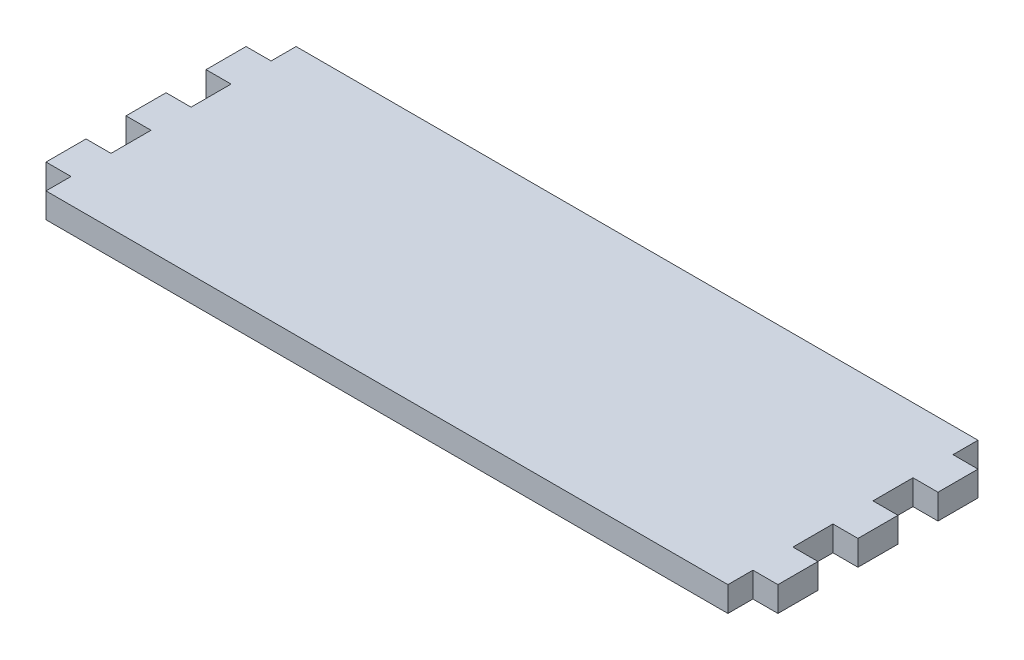
ISO-10303-21;
HEADER;
FILE_DESCRIPTION(('STEP AP214'),'2;1');
FILE_NAME('part.step','',(''),(''),'','','');
FILE_SCHEMA(('AUTOMOTIVE_DESIGN { 1 0 10303 214 1 1 1 1 }'));
ENDSEC;
DATA;
#1=APPLICATION_CONTEXT('core data for automotive mechanical design processes');
#2=APPLICATION_PROTOCOL_DEFINITION('international standard','automotive_design',2000,#1);
#3=PRODUCT_CONTEXT('',#1,'mechanical');
#4=PRODUCT('Part','Part','',(#3));
#5=PRODUCT_RELATED_PRODUCT_CATEGORY('part','',(#4));
#6=PRODUCT_DEFINITION_FORMATION('','',#4);
#7=PRODUCT_DEFINITION_CONTEXT('part definition',#1,'design');
#8=PRODUCT_DEFINITION('design','',#6,#7);
#9=PRODUCT_DEFINITION_SHAPE('','',#8);
#10=(LENGTH_UNIT() NAMED_UNIT(*) SI_UNIT(.MILLI.,.METRE.));
#11=(NAMED_UNIT(*) PLANE_ANGLE_UNIT() SI_UNIT($,.RADIAN.));
#12=(NAMED_UNIT(*) SI_UNIT($,.STERADIAN.) SOLID_ANGLE_UNIT());
#13=UNCERTAINTY_MEASURE_WITH_UNIT(LENGTH_MEASURE(1.E-05),#10,'distance_accuracy_value','');
#14=(GEOMETRIC_REPRESENTATION_CONTEXT(3) GLOBAL_UNCERTAINTY_ASSIGNED_CONTEXT((#13)) GLOBAL_UNIT_ASSIGNED_CONTEXT((#10,
#11,#12)) REPRESENTATION_CONTEXT('',''));
#15=CARTESIAN_POINT('',(0.,0.,0.));
#16=DIRECTION('',(0.,0.,1.));
#17=DIRECTION('',(1.,0.,0.));
#18=AXIS2_PLACEMENT_3D('',#15,#16,#17);
#19=CARTESIAN_POINT('',(-65.51933623944,3.,-2.9418119022154));
#20=DIRECTION('',(1.,0.,0.));
#21=DIRECTION('',(0.,0.,-1.));
#22=AXIS2_PLACEMENT_3D('',#19,#20,#21);
#23=PLANE('',#22);
#24=DIRECTION('',(0.,0.,1.));
#25=VECTOR('',#24,1.);
#26=CARTESIAN_POINT('',(-65.51933623944,0.,-2.9418119022154));
#27=LINE('',#26,#25);
#28=CARTESIAN_POINT('',(-65.51933623944,0.,-7.74181190221546));
#29=VERTEX_POINT('',#28);
#30=CARTESIAN_POINT('',(-65.51933623944,0.,-2.9418119022154));
#31=VERTEX_POINT('',#30);
#32=EDGE_CURVE('E260',#29,#31,#27,.T.);
#33=ORIENTED_EDGE('',*,*,#32,.T.);
#34=DIRECTION('',(0.,-1.,0.));
#35=VECTOR('',#34,1.);
#36=CARTESIAN_POINT('',(-65.51933623944,3.,-2.9418119022154));
#37=LINE('',#36,#35);
#38=CARTESIAN_POINT('',(-65.51933623944,3.,-2.9418119022154));
#39=VERTEX_POINT('',#38);
#40=EDGE_CURVE('E11',#39,#31,#37,.T.);
#41=ORIENTED_EDGE('',*,*,#40,.F.);
#42=DIRECTION('',(0.,0.,1.));
#43=VECTOR('',#42,1.);
#44=CARTESIAN_POINT('',(-65.51933623944,3.,-2.9418119022154));
#45=LINE('',#44,#43);
#46=CARTESIAN_POINT('',(-65.51933623944,3.,-7.74181190221546));
#47=VERTEX_POINT('',#46);
#48=EDGE_CURVE('E342',#47,#39,#45,.T.);
#49=ORIENTED_EDGE('',*,*,#48,.F.);
#50=DIRECTION('',(0.,-1.,0.));
#51=VECTOR('',#50,1.);
#52=CARTESIAN_POINT('',(-65.51933623944,3.,-7.74181190221546));
#53=LINE('',#52,#51);
#54=EDGE_CURVE('E256',#47,#29,#53,.T.);
#55=ORIENTED_EDGE('',*,*,#54,.T.);
#56=EDGE_LOOP('',(#33,#41,#49,#55));
#57=FACE_BOUND('',#56,.T.);
#58=ADVANCED_FACE('F39',(#57),#23,.F.);
#59=CARTESIAN_POINT('',(-62.51933623944,3.,-2.9418119022154));
#60=DIRECTION('',(0.,0.,-1.));
#61=DIRECTION('',(-1.,0.,0.));
#62=AXIS2_PLACEMENT_3D('',#59,#60,#61);
#63=PLANE('',#62);
#64=DIRECTION('',(1.,0.,0.));
#65=VECTOR('',#64,1.);
#66=CARTESIAN_POINT('',(-62.51933623944,0.,-2.9418119022154));
#67=LINE('',#66,#65);
#68=CARTESIAN_POINT('',(-62.51933623944,0.,-2.9418119022154));
#69=VERTEX_POINT('',#68);
#70=EDGE_CURVE('E264',#31,#69,#67,.T.);
#71=ORIENTED_EDGE('',*,*,#70,.T.);
#72=DIRECTION('',(0.,-1.,0.));
#73=VECTOR('',#72,1.);
#74=CARTESIAN_POINT('',(-62.51933623944,3.,-2.9418119022154));
#75=LINE('',#74,#73);
#76=CARTESIAN_POINT('',(-62.51933623944,3.,-2.9418119022154));
#77=VERTEX_POINT('',#76);
#78=EDGE_CURVE('E48',#77,#69,#75,.T.);
#79=ORIENTED_EDGE('',*,*,#78,.F.);
#80=DIRECTION('',(1.,0.,0.));
#81=VECTOR('',#80,1.);
#82=CARTESIAN_POINT('',(-62.51933623944,3.,-2.9418119022154));
#83=LINE('',#82,#81);
#84=EDGE_CURVE('E159',#39,#77,#83,.T.);
#85=ORIENTED_EDGE('',*,*,#84,.F.);
#86=ORIENTED_EDGE('',*,*,#40,.T.);
#87=EDGE_LOOP('',(#71,#79,#85,#86));
#88=FACE_BOUND('',#87,.T.);
#89=ADVANCED_FACE('F548',(#88),#63,.F.);
#90=CARTESIAN_POINT('',(-62.5193362394399,3.,1.8581880977846));
#91=DIRECTION('',(1.,0.,0.));
#92=DIRECTION('',(0.,0.,-1.));
#93=AXIS2_PLACEMENT_3D('',#90,#91,#92);
#94=PLANE('',#93);
#95=DIRECTION('',(0.,0.,1.));
#96=VECTOR('',#95,1.);
#97=CARTESIAN_POINT('',(-62.5193362394399,0.,1.8581880977846));
#98=LINE('',#97,#96);
#99=CARTESIAN_POINT('',(-62.5193362394399,0.,1.8581880977846));
#100=VERTEX_POINT('',#99);
#101=EDGE_CURVE('E267',#69,#100,#98,.T.);
#102=ORIENTED_EDGE('',*,*,#101,.T.);
#103=DIRECTION('',(0.,-1.,0.));
#104=VECTOR('',#103,1.);
#105=CARTESIAN_POINT('',(-62.5193362394399,3.,1.8581880977846));
#106=LINE('',#105,#104);
#107=CARTESIAN_POINT('',(-62.5193362394399,3.,1.8581880977846));
#108=VERTEX_POINT('',#107);
#109=EDGE_CURVE('E433',#108,#100,#106,.T.);
#110=ORIENTED_EDGE('',*,*,#109,.F.);
#111=DIRECTION('',(0.,0.,1.));
#112=VECTOR('',#111,1.);
#113=CARTESIAN_POINT('',(-62.5193362394399,3.,1.8581880977846));
#114=LINE('',#113,#112);
#115=EDGE_CURVE('E443',#77,#108,#114,.T.);
#116=ORIENTED_EDGE('',*,*,#115,.F.);
#117=ORIENTED_EDGE('',*,*,#78,.T.);
#118=EDGE_LOOP('',(#102,#110,#116,#117));
#119=FACE_BOUND('',#118,.T.);
#120=ADVANCED_FACE('F441',(#119),#94,.F.);
#121=CARTESIAN_POINT('',(-65.5193362394399,3.,1.8581880977846));
#122=DIRECTION('',(0.,0.,1.));
#123=DIRECTION('',(1.,0.,0.));
#124=AXIS2_PLACEMENT_3D('',#121,#122,#123);
#125=PLANE('',#124);
#126=DIRECTION('',(-1.,0.,0.));
#127=VECTOR('',#126,1.);
#128=CARTESIAN_POINT('',(-65.5193362394399,0.,1.8581880977846));
#129=LINE('',#128,#127);
#130=CARTESIAN_POINT('',(-65.5193362394399,0.,1.8581880977846));
#131=VERTEX_POINT('',#130);
#132=EDGE_CURVE('E270',#100,#131,#129,.T.);
#133=ORIENTED_EDGE('',*,*,#132,.T.);
#134=DIRECTION('',(0.,-1.,0.));
#135=VECTOR('',#134,1.);
#136=CARTESIAN_POINT('',(-65.5193362394399,3.,1.8581880977846));
#137=LINE('',#136,#135);
#138=CARTESIAN_POINT('',(-65.5193362394399,3.,1.8581880977846));
#139=VERTEX_POINT('',#138);
#140=EDGE_CURVE('E429',#139,#131,#137,.T.);
#141=ORIENTED_EDGE('',*,*,#140,.F.);
#142=DIRECTION('',(-1.,0.,0.));
#143=VECTOR('',#142,1.);
#144=CARTESIAN_POINT('',(-65.5193362394399,3.,1.8581880977846));
#145=LINE('',#144,#143);
#146=EDGE_CURVE('E462',#108,#139,#145,.T.);
#147=ORIENTED_EDGE('',*,*,#146,.F.);
#148=ORIENTED_EDGE('',*,*,#109,.T.);
#149=EDGE_LOOP('',(#133,#141,#147,#148));
#150=FACE_BOUND('',#149,.T.);
#151=ADVANCED_FACE('F452',(#150),#125,.F.);
#152=CARTESIAN_POINT('',(-65.5193362394399,3.,1.8581880977846));
#153=DIRECTION('',(1.,0.,0.));
#154=DIRECTION('',(0.,0.,-1.));
#155=AXIS2_PLACEMENT_3D('',#152,#153,#154);
#156=PLANE('',#155);
#157=DIRECTION('',(0.,0.,1.));
#158=VECTOR('',#157,1.);
#159=CARTESIAN_POINT('',(-65.5193362394399,0.,1.8581880977846));
#160=LINE('',#159,#158);
#161=CARTESIAN_POINT('',(-65.5193362394399,0.,6.6581880977846));
#162=VERTEX_POINT('',#161);
#163=EDGE_CURVE('E273',#131,#162,#160,.T.);
#164=ORIENTED_EDGE('',*,*,#163,.T.);
#165=DIRECTION('',(0.,-1.,0.));
#166=VECTOR('',#165,1.);
#167=CARTESIAN_POINT('',(-65.5193362394399,3.,6.6581880977846));
#168=LINE('',#167,#166);
#169=CARTESIAN_POINT('',(-65.5193362394399,3.,6.6581880977846));
#170=VERTEX_POINT('',#169);
#171=EDGE_CURVE('E425',#170,#162,#168,.T.);
#172=ORIENTED_EDGE('',*,*,#171,.F.);
#173=DIRECTION('',(0.,0.,1.));
#174=VECTOR('',#173,1.);
#175=CARTESIAN_POINT('',(-65.5193362394399,3.,1.8581880977846));
#176=LINE('',#175,#174);
#177=EDGE_CURVE('E458',#139,#170,#176,.T.);
#178=ORIENTED_EDGE('',*,*,#177,.F.);
#179=ORIENTED_EDGE('',*,*,#140,.T.);
#180=EDGE_LOOP('',(#164,#172,#178,#179));
#181=FACE_BOUND('',#180,.T.);
#182=ADVANCED_FACE('F456',(#181),#156,.F.);
#183=CARTESIAN_POINT('',(-65.5193362394399,3.,6.6581880977846));
#184=DIRECTION('',(0.,0.,-1.));
#185=DIRECTION('',(-1.,0.,0.));
#186=AXIS2_PLACEMENT_3D('',#183,#184,#185);
#187=PLANE('',#186);
#188=DIRECTION('',(1.,0.,0.));
#189=VECTOR('',#188,1.);
#190=CARTESIAN_POINT('',(-65.5193362394399,0.,6.6581880977846));
#191=LINE('',#190,#189);
#192=CARTESIAN_POINT('',(-62.5193362394399,0.,6.6581880977846));
#193=VERTEX_POINT('',#192);
#194=EDGE_CURVE('E276',#162,#193,#191,.T.);
#195=ORIENTED_EDGE('',*,*,#194,.T.);
#196=DIRECTION('',(0.,-1.,0.));
#197=VECTOR('',#196,1.);
#198=CARTESIAN_POINT('',(-62.5193362394399,3.,6.6581880977846));
#199=LINE('',#198,#197);
#200=CARTESIAN_POINT('',(-62.5193362394399,3.,6.6581880977846));
#201=VERTEX_POINT('',#200);
#202=EDGE_CURVE('E421',#201,#193,#199,.T.);
#203=ORIENTED_EDGE('',*,*,#202,.F.);
#204=DIRECTION('',(1.,0.,0.));
#205=VECTOR('',#204,1.);
#206=CARTESIAN_POINT('',(-65.5193362394399,3.,6.6581880977846));
#207=LINE('',#206,#205);
#208=EDGE_CURVE('E461',#170,#201,#207,.T.);
#209=ORIENTED_EDGE('',*,*,#208,.F.);
#210=ORIENTED_EDGE('',*,*,#171,.T.);
#211=EDGE_LOOP('',(#195,#203,#209,#210));
#212=FACE_BOUND('',#211,.T.);
#213=ADVANCED_FACE('F561',(#212),#187,.F.);
#214=CARTESIAN_POINT('',(-62.5193362394399,3.,6.6581880977846));
#215=DIRECTION('',(1.,0.,0.));
#216=DIRECTION('',(0.,0.,-1.));
#217=AXIS2_PLACEMENT_3D('',#214,#215,#216);
#218=PLANE('',#217);
#219=DIRECTION('',(0.,0.,1.));
#220=VECTOR('',#219,1.);
#221=CARTESIAN_POINT('',(-62.5193362394399,0.,6.6581880977846));
#222=LINE('',#221,#220);
#223=CARTESIAN_POINT('',(-62.5193362394399,0.,11.4581880977846));
#224=VERTEX_POINT('',#223);
#225=EDGE_CURVE('E279',#193,#224,#222,.T.);
#226=ORIENTED_EDGE('',*,*,#225,.T.);
#227=DIRECTION('',(0.,-1.,0.));
#228=VECTOR('',#227,1.);
#229=CARTESIAN_POINT('',(-62.5193362394399,3.,11.4581880977846));
#230=LINE('',#229,#228);
#231=CARTESIAN_POINT('',(-62.5193362394399,3.,11.4581880977846));
#232=VERTEX_POINT('',#231);
#233=EDGE_CURVE('E417',#232,#224,#230,.T.);
#234=ORIENTED_EDGE('',*,*,#233,.F.);
#235=DIRECTION('',(0.,0.,1.));
#236=VECTOR('',#235,1.);
#237=CARTESIAN_POINT('',(-62.5193362394399,3.,6.6581880977846));
#238=LINE('',#237,#236);
#239=EDGE_CURVE('E466',#201,#232,#238,.T.);
#240=ORIENTED_EDGE('',*,*,#239,.F.);
#241=ORIENTED_EDGE('',*,*,#202,.T.);
#242=EDGE_LOOP('',(#226,#234,#240,#241));
#243=FACE_BOUND('',#242,.T.);
#244=ADVANCED_FACE('F564',(#243),#218,.F.);
#245=CARTESIAN_POINT('',(-62.5193362394399,3.,11.4581880977846));
#246=DIRECTION('',(0.,0.,1.));
#247=DIRECTION('',(1.,0.,0.));
#248=AXIS2_PLACEMENT_3D('',#245,#246,#247);
#249=PLANE('',#248);
#250=DIRECTION('',(-1.,0.,0.));
#251=VECTOR('',#250,1.);
#252=CARTESIAN_POINT('',(-62.5193362394399,0.,11.4581880977846));
#253=LINE('',#252,#251);
#254=CARTESIAN_POINT('',(-65.51933623944,0.,11.4581880977845));
#255=VERTEX_POINT('',#254);
#256=EDGE_CURVE('E282',#224,#255,#253,.T.);
#257=ORIENTED_EDGE('',*,*,#256,.T.);
#258=DIRECTION('',(0.,-1.,0.));
#259=VECTOR('',#258,1.);
#260=CARTESIAN_POINT('',(-65.51933623944,3.,11.4581880977845));
#261=LINE('',#260,#259);
#262=CARTESIAN_POINT('',(-65.51933623944,3.,11.4581880977845));
#263=VERTEX_POINT('',#262);
#264=EDGE_CURVE('E413',#263,#255,#261,.T.);
#265=ORIENTED_EDGE('',*,*,#264,.F.);
#266=DIRECTION('',(-1.,0.,0.));
#267=VECTOR('',#266,1.);
#268=CARTESIAN_POINT('',(-62.5193362394399,3.,11.4581880977846));
#269=LINE('',#268,#267);
#270=EDGE_CURVE('E473',#232,#263,#269,.T.);
#271=ORIENTED_EDGE('',*,*,#270,.F.);
#272=ORIENTED_EDGE('',*,*,#233,.T.);
#273=EDGE_LOOP('',(#257,#265,#271,#272));
#274=FACE_BOUND('',#273,.T.);
#275=ADVANCED_FACE('F568',(#274),#249,.F.);
#276=CARTESIAN_POINT('',(-65.51933623944,3.,11.4581880977845));
#277=DIRECTION('',(1.,0.,0.));
#278=DIRECTION('',(0.,0.,-1.));
#279=AXIS2_PLACEMENT_3D('',#276,#277,#278);
#280=PLANE('',#279);
#281=DIRECTION('',(0.,0.,1.));
#282=VECTOR('',#281,1.);
#283=CARTESIAN_POINT('',(-65.51933623944,0.,11.4581880977845));
#284=LINE('',#283,#282);
#285=CARTESIAN_POINT('',(-65.51933623944,0.,16.2581880977845));
#286=VERTEX_POINT('',#285);
#287=EDGE_CURVE('E285',#255,#286,#284,.T.);
#288=ORIENTED_EDGE('',*,*,#287,.T.);
#289=DIRECTION('',(0.,-1.,0.));
#290=VECTOR('',#289,1.);
#291=CARTESIAN_POINT('',(-65.51933623944,3.,16.2581880977845));
#292=LINE('',#291,#290);
#293=CARTESIAN_POINT('',(-65.51933623944,3.,16.2581880977845));
#294=VERTEX_POINT('',#293);
#295=EDGE_CURVE('E409',#294,#286,#292,.T.);
#296=ORIENTED_EDGE('',*,*,#295,.F.);
#297=DIRECTION('',(0.,0.,1.));
#298=VECTOR('',#297,1.);
#299=CARTESIAN_POINT('',(-65.51933623944,3.,11.4581880977845));
#300=LINE('',#299,#298);
#301=EDGE_CURVE('E476',#263,#294,#300,.T.);
#302=ORIENTED_EDGE('',*,*,#301,.F.);
#303=ORIENTED_EDGE('',*,*,#264,.T.);
#304=EDGE_LOOP('',(#288,#296,#302,#303));
#305=FACE_BOUND('',#304,.T.);
#306=ADVANCED_FACE('F572',(#305),#280,.F.);
#307=CARTESIAN_POINT('',(-62.51933623944,3.,16.2581880977845));
#308=DIRECTION('',(0.,0.,-1.));
#309=DIRECTION('',(-1.,0.,0.));
#310=AXIS2_PLACEMENT_3D('',#307,#308,#309);
#311=PLANE('',#310);
#312=DIRECTION('',(1.,0.,0.));
#313=VECTOR('',#312,1.);
#314=CARTESIAN_POINT('',(-62.51933623944,0.,16.2581880977845));
#315=LINE('',#314,#313);
#316=CARTESIAN_POINT('',(-62.51933623944,0.,16.2581880977845));
#317=VERTEX_POINT('',#316);
#318=EDGE_CURVE('E288',#286,#317,#315,.T.);
#319=ORIENTED_EDGE('',*,*,#318,.T.);
#320=DIRECTION('',(0.,-1.,0.));
#321=VECTOR('',#320,1.);
#322=CARTESIAN_POINT('',(-62.51933623944,3.,16.2581880977845));
#323=LINE('',#322,#321);
#324=CARTESIAN_POINT('',(-62.51933623944,3.,16.2581880977845));
#325=VERTEX_POINT('',#324);
#326=EDGE_CURVE('E405',#325,#317,#323,.T.);
#327=ORIENTED_EDGE('',*,*,#326,.F.);
#328=DIRECTION('',(1.,0.,0.));
#329=VECTOR('',#328,1.);
#330=CARTESIAN_POINT('',(-62.51933623944,3.,16.2581880977845));
#331=LINE('',#330,#329);
#332=EDGE_CURVE('E479',#294,#325,#331,.T.);
#333=ORIENTED_EDGE('',*,*,#332,.F.);
#334=ORIENTED_EDGE('',*,*,#295,.T.);
#335=EDGE_LOOP('',(#319,#327,#333,#334));
#336=FACE_BOUND('',#335,.T.);
#337=ADVANCED_FACE('F576',(#336),#311,.F.);
#338=CARTESIAN_POINT('',(-62.51933623944,3.,19.2581880977845));
#339=DIRECTION('',(1.,0.,0.));
#340=DIRECTION('',(0.,0.,-1.));
#341=AXIS2_PLACEMENT_3D('',#338,#339,#340);
#342=PLANE('',#341);
#343=DIRECTION('',(0.,0.,1.));
#344=VECTOR('',#343,1.);
#345=CARTESIAN_POINT('',(-62.51933623944,0.,19.2581880977845));
#346=LINE('',#345,#344);
#347=CARTESIAN_POINT('',(-62.51933623944,0.,19.2581880977845));
#348=VERTEX_POINT('',#347);
#349=EDGE_CURVE('E291',#317,#348,#346,.T.);
#350=ORIENTED_EDGE('',*,*,#349,.T.);
#351=DIRECTION('',(0.,-1.,0.));
#352=VECTOR('',#351,1.);
#353=CARTESIAN_POINT('',(-62.51933623944,3.,19.2581880977845));
#354=LINE('',#353,#352);
#355=CARTESIAN_POINT('',(-62.51933623944,3.,19.2581880977845));
#356=VERTEX_POINT('',#355);
#357=EDGE_CURVE('E401',#356,#348,#354,.T.);
#358=ORIENTED_EDGE('',*,*,#357,.F.);
#359=DIRECTION('',(0.,0.,1.));
#360=VECTOR('',#359,1.);
#361=CARTESIAN_POINT('',(-62.51933623944,3.,19.2581880977845));
#362=LINE('',#361,#360);
#363=EDGE_CURVE('E482',#325,#356,#362,.T.);
#364=ORIENTED_EDGE('',*,*,#363,.F.);
#365=ORIENTED_EDGE('',*,*,#326,.T.);
#366=EDGE_LOOP('',(#350,#358,#364,#365));
#367=FACE_BOUND('',#366,.T.);
#368=ADVANCED_FACE('F580',(#367),#342,.F.);
#369=CARTESIAN_POINT('',(19.28066376056,3.,19.2581880977845));
#370=DIRECTION('',(0.,0.,-1.));
#371=DIRECTION('',(-1.,0.,0.));
#372=AXIS2_PLACEMENT_3D('',#369,#370,#371);
#373=PLANE('',#372);
#374=DIRECTION('',(1.,0.,0.));
#375=VECTOR('',#374,1.);
#376=CARTESIAN_POINT('',(19.28066376056,0.,19.2581880977845));
#377=LINE('',#376,#375);
#378=CARTESIAN_POINT('',(19.28066376056,0.,19.2581880977845));
#379=VERTEX_POINT('',#378);
#380=EDGE_CURVE('E294',#348,#379,#377,.T.);
#381=ORIENTED_EDGE('',*,*,#380,.T.);
#382=DIRECTION('',(0.,-1.,0.));
#383=VECTOR('',#382,1.);
#384=CARTESIAN_POINT('',(19.28066376056,3.,19.2581880977845));
#385=LINE('',#384,#383);
#386=CARTESIAN_POINT('',(19.28066376056,3.,19.2581880977845));
#387=VERTEX_POINT('',#386);
#388=EDGE_CURVE('E397',#387,#379,#385,.T.);
#389=ORIENTED_EDGE('',*,*,#388,.F.);
#390=DIRECTION('',(1.,0.,0.));
#391=VECTOR('',#390,1.);
#392=CARTESIAN_POINT('',(19.28066376056,3.,19.2581880977845));
#393=LINE('',#392,#391);
#394=EDGE_CURVE('E485',#356,#387,#393,.T.);
#395=ORIENTED_EDGE('',*,*,#394,.F.);
#396=ORIENTED_EDGE('',*,*,#357,.T.);
#397=EDGE_LOOP('',(#381,#389,#395,#396));
#398=FACE_BOUND('',#397,.T.);
#399=ADVANCED_FACE('F584',(#398),#373,.F.);
#400=CARTESIAN_POINT('',(19.28066376056,3.,16.2581880977845));
#401=DIRECTION('',(-1.,0.,0.));
#402=DIRECTION('',(0.,0.,1.));
#403=AXIS2_PLACEMENT_3D('',#400,#401,#402);
#404=PLANE('',#403);
#405=DIRECTION('',(0.,0.,-1.));
#406=VECTOR('',#405,1.);
#407=CARTESIAN_POINT('',(19.28066376056,0.,16.2581880977845));
#408=LINE('',#407,#406);
#409=CARTESIAN_POINT('',(19.28066376056,0.,16.2581880977845));
#410=VERTEX_POINT('',#409);
#411=EDGE_CURVE('E297',#379,#410,#408,.T.);
#412=ORIENTED_EDGE('',*,*,#411,.T.);
#413=DIRECTION('',(0.,-1.,0.));
#414=VECTOR('',#413,1.);
#415=CARTESIAN_POINT('',(19.28066376056,3.,16.2581880977845));
#416=LINE('',#415,#414);
#417=CARTESIAN_POINT('',(19.28066376056,3.,16.2581880977845));
#418=VERTEX_POINT('',#417);
#419=EDGE_CURVE('E393',#418,#410,#416,.T.);
#420=ORIENTED_EDGE('',*,*,#419,.F.);
#421=DIRECTION('',(0.,0.,-1.));
#422=VECTOR('',#421,1.);
#423=CARTESIAN_POINT('',(19.28066376056,3.,16.2581880977845));
#424=LINE('',#423,#422);
#425=EDGE_CURVE('E488',#387,#418,#424,.T.);
#426=ORIENTED_EDGE('',*,*,#425,.F.);
#427=ORIENTED_EDGE('',*,*,#388,.T.);
#428=EDGE_LOOP('',(#412,#420,#426,#427));
#429=FACE_BOUND('',#428,.T.);
#430=ADVANCED_FACE('F588',(#429),#404,.F.);
#431=CARTESIAN_POINT('',(22.28066376056,3.,16.2581880977845));
#432=DIRECTION('',(0.,0.,-1.));
#433=DIRECTION('',(-1.,0.,0.));
#434=AXIS2_PLACEMENT_3D('',#431,#432,#433);
#435=PLANE('',#434);
#436=DIRECTION('',(1.,0.,0.));
#437=VECTOR('',#436,1.);
#438=CARTESIAN_POINT('',(22.28066376056,0.,16.2581880977845));
#439=LINE('',#438,#437);
#440=CARTESIAN_POINT('',(22.28066376056,0.,16.2581880977845));
#441=VERTEX_POINT('',#440);
#442=EDGE_CURVE('E300',#410,#441,#439,.T.);
#443=ORIENTED_EDGE('',*,*,#442,.T.);
#444=DIRECTION('',(0.,-1.,0.));
#445=VECTOR('',#444,1.);
#446=CARTESIAN_POINT('',(22.28066376056,3.,16.2581880977845));
#447=LINE('',#446,#445);
#448=CARTESIAN_POINT('',(22.28066376056,3.,16.2581880977845));
#449=VERTEX_POINT('',#448);
#450=EDGE_CURVE('E389',#449,#441,#447,.T.);
#451=ORIENTED_EDGE('',*,*,#450,.F.);
#452=DIRECTION('',(1.,0.,0.));
#453=VECTOR('',#452,1.);
#454=CARTESIAN_POINT('',(22.28066376056,3.,16.2581880977845));
#455=LINE('',#454,#453);
#456=EDGE_CURVE('E491',#418,#449,#455,.T.);
#457=ORIENTED_EDGE('',*,*,#456,.F.);
#458=ORIENTED_EDGE('',*,*,#419,.T.);
#459=EDGE_LOOP('',(#443,#451,#457,#458));
#460=FACE_BOUND('',#459,.T.);
#461=ADVANCED_FACE('F592',(#460),#435,.F.);
#462=CARTESIAN_POINT('',(22.28066376056,3.,11.4581880977845));
#463=DIRECTION('',(-1.,0.,0.));
#464=DIRECTION('',(0.,0.,1.));
#465=AXIS2_PLACEMENT_3D('',#462,#463,#464);
#466=PLANE('',#465);
#467=DIRECTION('',(0.,0.,-1.));
#468=VECTOR('',#467,1.);
#469=CARTESIAN_POINT('',(22.28066376056,0.,11.4581880977845));
#470=LINE('',#469,#468);
#471=CARTESIAN_POINT('',(22.28066376056,0.,11.4581880977845));
#472=VERTEX_POINT('',#471);
#473=EDGE_CURVE('E303',#441,#472,#470,.T.);
#474=ORIENTED_EDGE('',*,*,#473,.T.);
#475=DIRECTION('',(0.,-1.,0.));
#476=VECTOR('',#475,1.);
#477=CARTESIAN_POINT('',(22.28066376056,3.,11.4581880977845));
#478=LINE('',#477,#476);
#479=CARTESIAN_POINT('',(22.28066376056,3.,11.4581880977845));
#480=VERTEX_POINT('',#479);
#481=EDGE_CURVE('E385',#480,#472,#478,.T.);
#482=ORIENTED_EDGE('',*,*,#481,.F.);
#483=DIRECTION('',(0.,0.,-1.));
#484=VECTOR('',#483,1.);
#485=CARTESIAN_POINT('',(22.28066376056,3.,11.4581880977845));
#486=LINE('',#485,#484);
#487=EDGE_CURVE('E494',#449,#480,#486,.T.);
#488=ORIENTED_EDGE('',*,*,#487,.F.);
#489=ORIENTED_EDGE('',*,*,#450,.T.);
#490=EDGE_LOOP('',(#474,#482,#488,#489));
#491=FACE_BOUND('',#490,.T.);
#492=ADVANCED_FACE('F596',(#491),#466,.F.);
#493=CARTESIAN_POINT('',(19.28066376056,3.,11.4581880977845));
#494=DIRECTION('',(0.,0.,1.));
#495=DIRECTION('',(1.,0.,0.));
#496=AXIS2_PLACEMENT_3D('',#493,#494,#495);
#497=PLANE('',#496);
#498=DIRECTION('',(-1.,0.,0.));
#499=VECTOR('',#498,1.);
#500=CARTESIAN_POINT('',(19.28066376056,0.,11.4581880977845));
#501=LINE('',#500,#499);
#502=CARTESIAN_POINT('',(19.28066376056,0.,11.4581880977845));
#503=VERTEX_POINT('',#502);
#504=EDGE_CURVE('E306',#472,#503,#501,.T.);
#505=ORIENTED_EDGE('',*,*,#504,.T.);
#506=DIRECTION('',(0.,-1.,0.));
#507=VECTOR('',#506,1.);
#508=CARTESIAN_POINT('',(19.28066376056,3.,11.4581880977845));
#509=LINE('',#508,#507);
#510=CARTESIAN_POINT('',(19.28066376056,3.,11.4581880977845));
#511=VERTEX_POINT('',#510);
#512=EDGE_CURVE('E381',#511,#503,#509,.T.);
#513=ORIENTED_EDGE('',*,*,#512,.F.);
#514=DIRECTION('',(-1.,0.,0.));
#515=VECTOR('',#514,1.);
#516=CARTESIAN_POINT('',(19.28066376056,3.,11.4581880977845));
#517=LINE('',#516,#515);
#518=EDGE_CURVE('E497',#480,#511,#517,.T.);
#519=ORIENTED_EDGE('',*,*,#518,.F.);
#520=ORIENTED_EDGE('',*,*,#481,.T.);
#521=EDGE_LOOP('',(#505,#513,#519,#520));
#522=FACE_BOUND('',#521,.T.);
#523=ADVANCED_FACE('F600',(#522),#497,.F.);
#524=CARTESIAN_POINT('',(19.2806637605601,3.,6.65818809778454));
#525=DIRECTION('',(-1.,0.,0.));
#526=DIRECTION('',(0.,0.,1.));
#527=AXIS2_PLACEMENT_3D('',#524,#525,#526);
#528=PLANE('',#527);
#529=DIRECTION('',(0.,0.,-1.));
#530=VECTOR('',#529,1.);
#531=CARTESIAN_POINT('',(19.2806637605601,0.,6.65818809778454));
#532=LINE('',#531,#530);
#533=CARTESIAN_POINT('',(19.2806637605601,0.,6.65818809778454));
#534=VERTEX_POINT('',#533);
#535=EDGE_CURVE('E309',#503,#534,#532,.T.);
#536=ORIENTED_EDGE('',*,*,#535,.T.);
#537=DIRECTION('',(0.,-1.,0.));
#538=VECTOR('',#537,1.);
#539=CARTESIAN_POINT('',(19.2806637605601,3.,6.65818809778454));
#540=LINE('',#539,#538);
#541=CARTESIAN_POINT('',(19.2806637605601,3.,6.65818809778454));
#542=VERTEX_POINT('',#541);
#543=EDGE_CURVE('E377',#542,#534,#540,.T.);
#544=ORIENTED_EDGE('',*,*,#543,.F.);
#545=DIRECTION('',(0.,0.,-1.));
#546=VECTOR('',#545,1.);
#547=CARTESIAN_POINT('',(19.2806637605601,3.,6.65818809778454));
#548=LINE('',#547,#546);
#549=EDGE_CURVE('E500',#511,#542,#548,.T.);
#550=ORIENTED_EDGE('',*,*,#549,.F.);
#551=ORIENTED_EDGE('',*,*,#512,.T.);
#552=EDGE_LOOP('',(#536,#544,#550,#551));
#553=FACE_BOUND('',#552,.T.);
#554=ADVANCED_FACE('F604',(#553),#528,.F.);
#555=CARTESIAN_POINT('',(22.2806637605601,3.,6.65818809778454));
#556=DIRECTION('',(0.,0.,-1.));
#557=DIRECTION('',(-1.,0.,0.));
#558=AXIS2_PLACEMENT_3D('',#555,#556,#557);
#559=PLANE('',#558);
#560=DIRECTION('',(1.,0.,0.));
#561=VECTOR('',#560,1.);
#562=CARTESIAN_POINT('',(22.2806637605601,0.,6.65818809778454));
#563=LINE('',#562,#561);
#564=CARTESIAN_POINT('',(22.2806637605601,0.,6.65818809778454));
#565=VERTEX_POINT('',#564);
#566=EDGE_CURVE('E312',#534,#565,#563,.T.);
#567=ORIENTED_EDGE('',*,*,#566,.T.);
#568=DIRECTION('',(0.,-1.,0.));
#569=VECTOR('',#568,1.);
#570=CARTESIAN_POINT('',(22.2806637605601,3.,6.65818809778454));
#571=LINE('',#570,#569);
#572=CARTESIAN_POINT('',(22.2806637605601,3.,6.65818809778454));
#573=VERTEX_POINT('',#572);
#574=EDGE_CURVE('E373',#573,#565,#571,.T.);
#575=ORIENTED_EDGE('',*,*,#574,.F.);
#576=DIRECTION('',(1.,0.,0.));
#577=VECTOR('',#576,1.);
#578=CARTESIAN_POINT('',(22.2806637605601,3.,6.65818809778454));
#579=LINE('',#578,#577);
#580=EDGE_CURVE('E503',#542,#573,#579,.T.);
#581=ORIENTED_EDGE('',*,*,#580,.F.);
#582=ORIENTED_EDGE('',*,*,#543,.T.);
#583=EDGE_LOOP('',(#567,#575,#581,#582));
#584=FACE_BOUND('',#583,.T.);
#585=ADVANCED_FACE('F608',(#584),#559,.F.);
#586=CARTESIAN_POINT('',(22.2806637605601,3.,1.85818809778454));
#587=DIRECTION('',(-1.,0.,0.));
#588=DIRECTION('',(0.,0.,1.));
#589=AXIS2_PLACEMENT_3D('',#586,#587,#588);
#590=PLANE('',#589);
#591=DIRECTION('',(0.,0.,-1.));
#592=VECTOR('',#591,1.);
#593=CARTESIAN_POINT('',(22.2806637605601,0.,1.85818809778454));
#594=LINE('',#593,#592);
#595=CARTESIAN_POINT('',(22.2806637605601,0.,1.85818809778454));
#596=VERTEX_POINT('',#595);
#597=EDGE_CURVE('E315',#565,#596,#594,.T.);
#598=ORIENTED_EDGE('',*,*,#597,.T.);
#599=DIRECTION('',(0.,-1.,0.));
#600=VECTOR('',#599,1.);
#601=CARTESIAN_POINT('',(22.2806637605601,3.,1.85818809778454));
#602=LINE('',#601,#600);
#603=CARTESIAN_POINT('',(22.2806637605601,3.,1.85818809778454));
#604=VERTEX_POINT('',#603);
#605=EDGE_CURVE('E369',#604,#596,#602,.T.);
#606=ORIENTED_EDGE('',*,*,#605,.F.);
#607=DIRECTION('',(0.,0.,-1.));
#608=VECTOR('',#607,1.);
#609=CARTESIAN_POINT('',(22.2806637605601,3.,1.85818809778454));
#610=LINE('',#609,#608);
#611=EDGE_CURVE('E506',#573,#604,#610,.T.);
#612=ORIENTED_EDGE('',*,*,#611,.F.);
#613=ORIENTED_EDGE('',*,*,#574,.T.);
#614=EDGE_LOOP('',(#598,#606,#612,#613));
#615=FACE_BOUND('',#614,.T.);
#616=ADVANCED_FACE('F612',(#615),#590,.F.);
#617=CARTESIAN_POINT('',(19.28066376056,3.,1.85818809778454));
#618=DIRECTION('',(0.,0.,1.));
#619=DIRECTION('',(1.,0.,0.));
#620=AXIS2_PLACEMENT_3D('',#617,#618,#619);
#621=PLANE('',#620);
#622=DIRECTION('',(-1.,0.,0.));
#623=VECTOR('',#622,1.);
#624=CARTESIAN_POINT('',(19.28066376056,0.,1.85818809778454));
#625=LINE('',#624,#623);
#626=CARTESIAN_POINT('',(19.28066376056,0.,1.85818809778454));
#627=VERTEX_POINT('',#626);
#628=EDGE_CURVE('E318',#596,#627,#625,.T.);
#629=ORIENTED_EDGE('',*,*,#628,.T.);
#630=DIRECTION('',(0.,-1.,0.));
#631=VECTOR('',#630,1.);
#632=CARTESIAN_POINT('',(19.28066376056,3.,1.85818809778454));
#633=LINE('',#632,#631);
#634=CARTESIAN_POINT('',(19.28066376056,3.,1.85818809778454));
#635=VERTEX_POINT('',#634);
#636=EDGE_CURVE('E365',#635,#627,#633,.T.);
#637=ORIENTED_EDGE('',*,*,#636,.F.);
#638=DIRECTION('',(-1.,0.,0.));
#639=VECTOR('',#638,1.);
#640=CARTESIAN_POINT('',(19.28066376056,3.,1.85818809778454));
#641=LINE('',#640,#639);
#642=EDGE_CURVE('E509',#604,#635,#641,.T.);
#643=ORIENTED_EDGE('',*,*,#642,.F.);
#644=ORIENTED_EDGE('',*,*,#605,.T.);
#645=EDGE_LOOP('',(#629,#637,#643,#644));
#646=FACE_BOUND('',#645,.T.);
#647=ADVANCED_FACE('F616',(#646),#621,.F.);
#648=CARTESIAN_POINT('',(19.28066376056,3.,-2.94181190221546));
#649=DIRECTION('',(-1.,0.,0.));
#650=DIRECTION('',(0.,0.,1.));
#651=AXIS2_PLACEMENT_3D('',#648,#649,#650);
#652=PLANE('',#651);
#653=DIRECTION('',(0.,0.,-1.));
#654=VECTOR('',#653,1.);
#655=CARTESIAN_POINT('',(19.28066376056,0.,-2.94181190221546));
#656=LINE('',#655,#654);
#657=CARTESIAN_POINT('',(19.28066376056,0.,-2.94181190221546));
#658=VERTEX_POINT('',#657);
#659=EDGE_CURVE('E321',#627,#658,#656,.T.);
#660=ORIENTED_EDGE('',*,*,#659,.T.);
#661=DIRECTION('',(0.,-1.,0.));
#662=VECTOR('',#661,1.);
#663=CARTESIAN_POINT('',(19.28066376056,3.,-2.94181190221546));
#664=LINE('',#663,#662);
#665=CARTESIAN_POINT('',(19.28066376056,3.,-2.94181190221546));
#666=VERTEX_POINT('',#665);
#667=EDGE_CURVE('E361',#666,#658,#664,.T.);
#668=ORIENTED_EDGE('',*,*,#667,.F.);
#669=DIRECTION('',(0.,0.,-1.));
#670=VECTOR('',#669,1.);
#671=CARTESIAN_POINT('',(19.28066376056,3.,-2.94181190221546));
#672=LINE('',#671,#670);
#673=EDGE_CURVE('E512',#635,#666,#672,.T.);
#674=ORIENTED_EDGE('',*,*,#673,.F.);
#675=ORIENTED_EDGE('',*,*,#636,.T.);
#676=EDGE_LOOP('',(#660,#668,#674,#675));
#677=FACE_BOUND('',#676,.T.);
#678=ADVANCED_FACE('F620',(#677),#652,.F.);
#679=CARTESIAN_POINT('',(22.28066376056,3.,-2.94181190221546));
#680=DIRECTION('',(0.,0.,-1.));
#681=DIRECTION('',(-1.,0.,0.));
#682=AXIS2_PLACEMENT_3D('',#679,#680,#681);
#683=PLANE('',#682);
#684=DIRECTION('',(1.,0.,0.));
#685=VECTOR('',#684,1.);
#686=CARTESIAN_POINT('',(22.28066376056,0.,-2.94181190221546));
#687=LINE('',#686,#685);
#688=CARTESIAN_POINT('',(22.28066376056,0.,-2.94181190221546));
#689=VERTEX_POINT('',#688);
#690=EDGE_CURVE('E324',#658,#689,#687,.T.);
#691=ORIENTED_EDGE('',*,*,#690,.T.);
#692=DIRECTION('',(0.,-1.,0.));
#693=VECTOR('',#692,1.);
#694=CARTESIAN_POINT('',(22.28066376056,3.,-2.94181190221546));
#695=LINE('',#694,#693);
#696=CARTESIAN_POINT('',(22.28066376056,3.,-2.94181190221546));
#697=VERTEX_POINT('',#696);
#698=EDGE_CURVE('E357',#697,#689,#695,.T.);
#699=ORIENTED_EDGE('',*,*,#698,.F.);
#700=DIRECTION('',(1.,0.,0.));
#701=VECTOR('',#700,1.);
#702=CARTESIAN_POINT('',(22.28066376056,3.,-2.94181190221546));
#703=LINE('',#702,#701);
#704=EDGE_CURVE('E515',#666,#697,#703,.T.);
#705=ORIENTED_EDGE('',*,*,#704,.F.);
#706=ORIENTED_EDGE('',*,*,#667,.T.);
#707=EDGE_LOOP('',(#691,#699,#705,#706));
#708=FACE_BOUND('',#707,.T.);
#709=ADVANCED_FACE('F624',(#708),#683,.F.);
#710=CARTESIAN_POINT('',(22.28066376056,3.,-7.74181190221545));
#711=DIRECTION('',(-1.,0.,0.));
#712=DIRECTION('',(0.,0.,1.));
#713=AXIS2_PLACEMENT_3D('',#710,#711,#712);
#714=PLANE('',#713);
#715=DIRECTION('',(0.,0.,-1.));
#716=VECTOR('',#715,1.);
#717=CARTESIAN_POINT('',(22.28066376056,0.,-7.74181190221545));
#718=LINE('',#717,#716);
#719=CARTESIAN_POINT('',(22.28066376056,0.,-7.74181190221545));
#720=VERTEX_POINT('',#719);
#721=EDGE_CURVE('E327',#689,#720,#718,.T.);
#722=ORIENTED_EDGE('',*,*,#721,.T.);
#723=DIRECTION('',(0.,-1.,0.));
#724=VECTOR('',#723,1.);
#725=CARTESIAN_POINT('',(22.28066376056,3.,-7.74181190221545));
#726=LINE('',#725,#724);
#727=CARTESIAN_POINT('',(22.28066376056,3.,-7.74181190221545));
#728=VERTEX_POINT('',#727);
#729=EDGE_CURVE('E353',#728,#720,#726,.T.);
#730=ORIENTED_EDGE('',*,*,#729,.F.);
#731=DIRECTION('',(0.,0.,-1.));
#732=VECTOR('',#731,1.);
#733=CARTESIAN_POINT('',(22.28066376056,3.,-7.74181190221545));
#734=LINE('',#733,#732);
#735=EDGE_CURVE('E518',#697,#728,#734,.T.);
#736=ORIENTED_EDGE('',*,*,#735,.F.);
#737=ORIENTED_EDGE('',*,*,#698,.T.);
#738=EDGE_LOOP('',(#722,#730,#736,#737));
#739=FACE_BOUND('',#738,.T.);
#740=ADVANCED_FACE('F628',(#739),#714,.F.);
#741=CARTESIAN_POINT('',(19.28066376056,3.,-7.74181190221545));
#742=DIRECTION('',(0.,0.,1.));
#743=DIRECTION('',(1.,0.,0.));
#744=AXIS2_PLACEMENT_3D('',#741,#742,#743);
#745=PLANE('',#744);
#746=DIRECTION('',(-1.,0.,0.));
#747=VECTOR('',#746,1.);
#748=CARTESIAN_POINT('',(19.28066376056,0.,-7.74181190221545));
#749=LINE('',#748,#747);
#750=CARTESIAN_POINT('',(19.28066376056,0.,-7.74181190221545));
#751=VERTEX_POINT('',#750);
#752=EDGE_CURVE('E330',#720,#751,#749,.T.);
#753=ORIENTED_EDGE('',*,*,#752,.T.);
#754=DIRECTION('',(0.,-1.,0.));
#755=VECTOR('',#754,1.);
#756=CARTESIAN_POINT('',(19.28066376056,3.,-7.74181190221545));
#757=LINE('',#756,#755);
#758=CARTESIAN_POINT('',(19.28066376056,3.,-7.74181190221545));
#759=VERTEX_POINT('',#758);
#760=EDGE_CURVE('E349',#759,#751,#757,.T.);
#761=ORIENTED_EDGE('',*,*,#760,.F.);
#762=DIRECTION('',(-1.,0.,0.));
#763=VECTOR('',#762,1.);
#764=CARTESIAN_POINT('',(19.28066376056,3.,-7.74181190221545));
#765=LINE('',#764,#763);
#766=EDGE_CURVE('E521',#728,#759,#765,.T.);
#767=ORIENTED_EDGE('',*,*,#766,.F.);
#768=ORIENTED_EDGE('',*,*,#729,.T.);
#769=EDGE_LOOP('',(#753,#761,#767,#768));
#770=FACE_BOUND('',#769,.T.);
#771=ADVANCED_FACE('F529',(#770),#745,.F.);
#772=CARTESIAN_POINT('',(19.28066376056,3.,-10.7418119022155));
#773=DIRECTION('',(-1.,0.,0.));
#774=DIRECTION('',(0.,0.,1.));
#775=AXIS2_PLACEMENT_3D('',#772,#773,#774);
#776=PLANE('',#775);
#777=DIRECTION('',(0.,0.,-1.));
#778=VECTOR('',#777,1.);
#779=CARTESIAN_POINT('',(19.28066376056,0.,-10.7418119022155));
#780=LINE('',#779,#778);
#781=CARTESIAN_POINT('',(19.28066376056,0.,-10.7418119022155));
#782=VERTEX_POINT('',#781);
#783=EDGE_CURVE('E333',#751,#782,#780,.T.);
#784=ORIENTED_EDGE('',*,*,#783,.T.);
#785=DIRECTION('',(0.,-1.,0.));
#786=VECTOR('',#785,1.);
#787=CARTESIAN_POINT('',(19.28066376056,3.,-10.7418119022155));
#788=LINE('',#787,#786);
#789=CARTESIAN_POINT('',(19.28066376056,3.,-10.7418119022155));
#790=VERTEX_POINT('',#789);
#791=EDGE_CURVE('E249',#790,#782,#788,.T.);
#792=ORIENTED_EDGE('',*,*,#791,.F.);
#793=DIRECTION('',(0.,0.,-1.));
#794=VECTOR('',#793,1.);
#795=CARTESIAN_POINT('',(19.28066376056,3.,-10.7418119022155));
#796=LINE('',#795,#794);
#797=EDGE_CURVE('E238',#759,#790,#796,.T.);
#798=ORIENTED_EDGE('',*,*,#797,.F.);
#799=ORIENTED_EDGE('',*,*,#760,.T.);
#800=EDGE_LOOP('',(#784,#792,#798,#799));
#801=FACE_BOUND('',#800,.T.);
#802=ADVANCED_FACE('F533',(#801),#776,.F.);
#803=CARTESIAN_POINT('',(-62.51933623944,3.,-10.7418119022155));
#804=DIRECTION('',(0.,0.,1.));
#805=DIRECTION('',(1.,0.,0.));
#806=AXIS2_PLACEMENT_3D('',#803,#804,#805);
#807=PLANE('',#806);
#808=DIRECTION('',(-1.,0.,0.));
#809=VECTOR('',#808,1.);
#810=CARTESIAN_POINT('',(-62.51933623944,0.,-10.7418119022155));
#811=LINE('',#810,#809);
#812=CARTESIAN_POINT('',(-62.51933623944,0.,-10.7418119022155));
#813=VERTEX_POINT('',#812);
#814=EDGE_CURVE('E247',#782,#813,#811,.T.);
#815=ORIENTED_EDGE('',*,*,#814,.T.);
#816=DIRECTION('',(0.,-1.,0.));
#817=VECTOR('',#816,1.);
#818=CARTESIAN_POINT('',(-62.51933623944,3.,-10.7418119022155));
#819=LINE('',#818,#817);
#820=CARTESIAN_POINT('',(-62.51933623944,3.,-10.7418119022155));
#821=VERTEX_POINT('',#820);
#822=EDGE_CURVE('E244',#821,#813,#819,.T.);
#823=ORIENTED_EDGE('',*,*,#822,.F.);
#824=DIRECTION('',(-1.,0.,0.));
#825=VECTOR('',#824,1.);
#826=CARTESIAN_POINT('',(-62.51933623944,3.,-10.7418119022155));
#827=LINE('',#826,#825);
#828=EDGE_CURVE('E232',#790,#821,#827,.T.);
#829=ORIENTED_EDGE('',*,*,#828,.F.);
#830=ORIENTED_EDGE('',*,*,#791,.T.);
#831=EDGE_LOOP('',(#815,#823,#829,#830));
#832=FACE_BOUND('',#831,.T.);
#833=ADVANCED_FACE('F245',(#832),#807,.F.);
#834=CARTESIAN_POINT('',(-62.51933623944,3.,-7.74181190221546));
#835=DIRECTION('',(1.,0.,0.));
#836=DIRECTION('',(0.,0.,-1.));
#837=AXIS2_PLACEMENT_3D('',#834,#835,#836);
#838=PLANE('',#837);
#839=DIRECTION('',(0.,0.,1.));
#840=VECTOR('',#839,1.);
#841=CARTESIAN_POINT('',(-62.51933623944,0.,-7.74181190221546));
#842=LINE('',#841,#840);
#843=CARTESIAN_POINT('',(-62.51933623944,0.,-7.74181190221546));
#844=VERTEX_POINT('',#843);
#845=EDGE_CURVE('E145',#813,#844,#842,.T.);
#846=ORIENTED_EDGE('',*,*,#845,.T.);
#847=DIRECTION('',(0.,-1.,0.));
#848=VECTOR('',#847,1.);
#849=CARTESIAN_POINT('',(-62.51933623944,3.,-7.74181190221546));
#850=LINE('',#849,#848);
#851=CARTESIAN_POINT('',(-62.51933623944,3.,-7.74181190221546));
#852=VERTEX_POINT('',#851);
#853=EDGE_CURVE('E250',#852,#844,#850,.T.);
#854=ORIENTED_EDGE('',*,*,#853,.F.);
#855=DIRECTION('',(0.,0.,1.));
#856=VECTOR('',#855,1.);
#857=CARTESIAN_POINT('',(-62.51933623944,3.,-7.74181190221546));
#858=LINE('',#857,#856);
#859=EDGE_CURVE('E236',#821,#852,#858,.T.);
#860=ORIENTED_EDGE('',*,*,#859,.F.);
#861=ORIENTED_EDGE('',*,*,#822,.T.);
#862=EDGE_LOOP('',(#846,#854,#860,#861));
#863=FACE_BOUND('',#862,.T.);
#864=ADVANCED_FACE('F252',(#863),#838,.F.);
#865=CARTESIAN_POINT('',(-65.51933623944,3.,-7.74181190221546));
#866=DIRECTION('',(0.,0.,1.));
#867=DIRECTION('',(1.,0.,0.));
#868=AXIS2_PLACEMENT_3D('',#865,#866,#867);
#869=PLANE('',#868);
#870=DIRECTION('',(-1.,0.,0.));
#871=VECTOR('',#870,1.);
#872=CARTESIAN_POINT('',(-65.51933623944,0.,-7.74181190221546));
#873=LINE('',#872,#871);
#874=EDGE_CURVE('E151',#844,#29,#873,.T.);
#875=ORIENTED_EDGE('',*,*,#874,.T.);
#876=ORIENTED_EDGE('',*,*,#54,.F.);
#877=DIRECTION('',(-1.,0.,0.));
#878=VECTOR('',#877,1.);
#879=CARTESIAN_POINT('',(-65.51933623944,3.,-7.74181190221546));
#880=LINE('',#879,#878);
#881=EDGE_CURVE('E56',#852,#47,#880,.T.);
#882=ORIENTED_EDGE('',*,*,#881,.F.);
#883=ORIENTED_EDGE('',*,*,#853,.T.);
#884=EDGE_LOOP('',(#875,#876,#882,#883));
#885=FACE_BOUND('',#884,.T.);
#886=ADVANCED_FACE('F537',(#885),#869,.F.);
#887=CARTESIAN_POINT('',(0.,3.,0.));
#888=DIRECTION('',(0.,-1.,0.));
#889=DIRECTION('',(0.,0.,-1.));
#890=AXIS2_PLACEMENT_3D('',#887,#888,#889);
#891=PLANE('',#890);
#892=ORIENTED_EDGE('',*,*,#48,.T.);
#893=ORIENTED_EDGE('',*,*,#84,.T.);
#894=ORIENTED_EDGE('',*,*,#115,.T.);
#895=ORIENTED_EDGE('',*,*,#146,.T.);
#896=ORIENTED_EDGE('',*,*,#177,.T.);
#897=ORIENTED_EDGE('',*,*,#208,.T.);
#898=ORIENTED_EDGE('',*,*,#239,.T.);
#899=ORIENTED_EDGE('',*,*,#270,.T.);
#900=ORIENTED_EDGE('',*,*,#301,.T.);
#901=ORIENTED_EDGE('',*,*,#332,.T.);
#902=ORIENTED_EDGE('',*,*,#363,.T.);
#903=ORIENTED_EDGE('',*,*,#394,.T.);
#904=ORIENTED_EDGE('',*,*,#425,.T.);
#905=ORIENTED_EDGE('',*,*,#456,.T.);
#906=ORIENTED_EDGE('',*,*,#487,.T.);
#907=ORIENTED_EDGE('',*,*,#518,.T.);
#908=ORIENTED_EDGE('',*,*,#549,.T.);
#909=ORIENTED_EDGE('',*,*,#580,.T.);
#910=ORIENTED_EDGE('',*,*,#611,.T.);
#911=ORIENTED_EDGE('',*,*,#642,.T.);
#912=ORIENTED_EDGE('',*,*,#673,.T.);
#913=ORIENTED_EDGE('',*,*,#704,.T.);
#914=ORIENTED_EDGE('',*,*,#735,.T.);
#915=ORIENTED_EDGE('',*,*,#766,.T.);
#916=ORIENTED_EDGE('',*,*,#797,.T.);
#917=ORIENTED_EDGE('',*,*,#828,.T.);
#918=ORIENTED_EDGE('',*,*,#859,.T.);
#919=ORIENTED_EDGE('',*,*,#881,.T.);
#920=EDGE_LOOP('',(#892,#893,#894,#895,#896,#897,#898,#899,#900,#901,#902,#903,#904,#905,#906,
#907,#908,#909,#910,#911,#912,#913,#914,#915,#916,#917,#918,#919));
#921=FACE_BOUND('',#920,.T.);
#922=ADVANCED_FACE('F234',(#921),#891,.F.);
#923=CARTESIAN_POINT('',(0.,0.,0.));
#924=DIRECTION('',(0.,-1.,0.));
#925=DIRECTION('',(0.,0.,-1.));
#926=AXIS2_PLACEMENT_3D('',#923,#924,#925);
#927=PLANE('',#926);
#928=ORIENTED_EDGE('',*,*,#32,.F.);
#929=ORIENTED_EDGE('',*,*,#874,.F.);
#930=ORIENTED_EDGE('',*,*,#845,.F.);
#931=ORIENTED_EDGE('',*,*,#814,.F.);
#932=ORIENTED_EDGE('',*,*,#783,.F.);
#933=ORIENTED_EDGE('',*,*,#752,.F.);
#934=ORIENTED_EDGE('',*,*,#721,.F.);
#935=ORIENTED_EDGE('',*,*,#690,.F.);
#936=ORIENTED_EDGE('',*,*,#659,.F.);
#937=ORIENTED_EDGE('',*,*,#628,.F.);
#938=ORIENTED_EDGE('',*,*,#597,.F.);
#939=ORIENTED_EDGE('',*,*,#566,.F.);
#940=ORIENTED_EDGE('',*,*,#535,.F.);
#941=ORIENTED_EDGE('',*,*,#504,.F.);
#942=ORIENTED_EDGE('',*,*,#473,.F.);
#943=ORIENTED_EDGE('',*,*,#442,.F.);
#944=ORIENTED_EDGE('',*,*,#411,.F.);
#945=ORIENTED_EDGE('',*,*,#380,.F.);
#946=ORIENTED_EDGE('',*,*,#349,.F.);
#947=ORIENTED_EDGE('',*,*,#318,.F.);
#948=ORIENTED_EDGE('',*,*,#287,.F.);
#949=ORIENTED_EDGE('',*,*,#256,.F.);
#950=ORIENTED_EDGE('',*,*,#225,.F.);
#951=ORIENTED_EDGE('',*,*,#194,.F.);
#952=ORIENTED_EDGE('',*,*,#163,.F.);
#953=ORIENTED_EDGE('',*,*,#132,.F.);
#954=ORIENTED_EDGE('',*,*,#101,.F.);
#955=ORIENTED_EDGE('',*,*,#70,.F.);
#956=EDGE_LOOP('',(#928,#929,#930,#931,#932,#933,#934,#935,#936,#937,#938,#939,#940,#941,#942,
#943,#944,#945,#946,#947,#948,#949,#950,#951,#952,#953,#954,#955));
#957=FACE_BOUND('',#956,.T.);
#958=ADVANCED_FACE('F447',(#957),#927,.T.);
#959=CLOSED_SHELL('',(#58,#89,#120,#151,#182,#213,#244,#275,#306,#337,#368,#399,#430,#461,#492,
#523,#554,#585,#616,#647,#678,#709,#740,#771,#802,#833,#864,#886,#922,#958));
#960=MANIFOLD_SOLID_BREP('B2',#959);
#961=ADVANCED_BREP_SHAPE_REPRESENTATION('',(#18,#960),#14);
#962=SHAPE_DEFINITION_REPRESENTATION(#9,#961);
ENDSEC;
END-ISO-10303-21;
